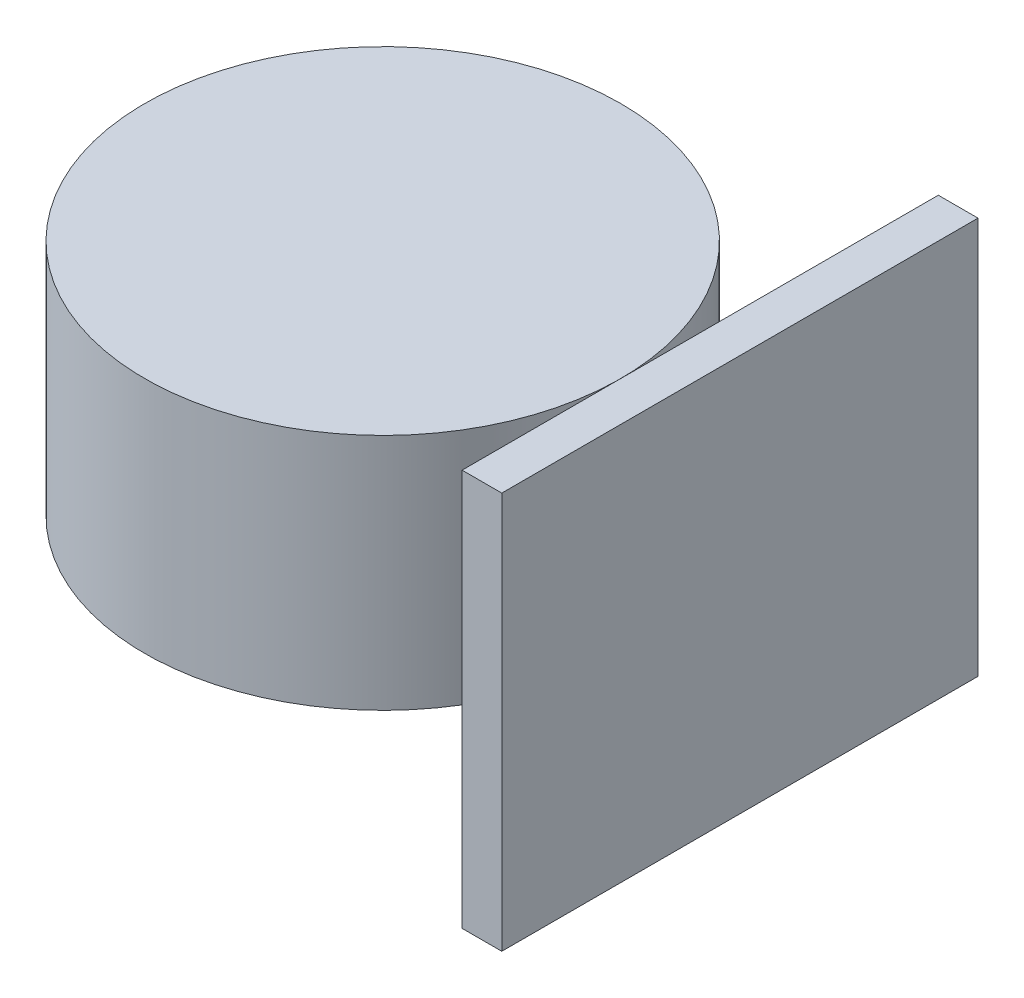
ISO-10303-21;
HEADER;
FILE_DESCRIPTION(('STEP AP214'),'2;1');
FILE_NAME('part.step','',(''),(''),'','','');
FILE_SCHEMA(('AUTOMOTIVE_DESIGN { 1 0 10303 214 1 1 1 1 }'));
ENDSEC;
DATA;
#1=APPLICATION_CONTEXT('core data for automotive mechanical design processes');
#2=APPLICATION_PROTOCOL_DEFINITION('international standard','automotive_design',2000,#1);
#3=PRODUCT_CONTEXT('',#1,'mechanical');
#4=PRODUCT('Part','Part','',(#3));
#5=PRODUCT_RELATED_PRODUCT_CATEGORY('part','',(#4));
#6=PRODUCT_DEFINITION_FORMATION('','',#4);
#7=PRODUCT_DEFINITION_CONTEXT('part definition',#1,'design');
#8=PRODUCT_DEFINITION('design','',#6,#7);
#9=PRODUCT_DEFINITION_SHAPE('','',#8);
#10=(LENGTH_UNIT() NAMED_UNIT(*) SI_UNIT(.MILLI.,.METRE.));
#11=(NAMED_UNIT(*) PLANE_ANGLE_UNIT() SI_UNIT($,.RADIAN.));
#12=(NAMED_UNIT(*) SI_UNIT($,.STERADIAN.) SOLID_ANGLE_UNIT());
#13=UNCERTAINTY_MEASURE_WITH_UNIT(LENGTH_MEASURE(1.E-05),#10,'distance_accuracy_value','');
#14=(GEOMETRIC_REPRESENTATION_CONTEXT(3) GLOBAL_UNCERTAINTY_ASSIGNED_CONTEXT((#13)) GLOBAL_UNIT_ASSIGNED_CONTEXT((#10,
#11,#12)) REPRESENTATION_CONTEXT('',''));
#15=CARTESIAN_POINT('',(0.,0.,0.));
#16=DIRECTION('',(0.,0.,1.));
#17=DIRECTION('',(1.,0.,0.));
#18=AXIS2_PLACEMENT_3D('',#15,#16,#17);
#19=CARTESIAN_POINT('',(0.,15.,0.));
#20=DIRECTION('',(0.,-1.,0.));
#21=DIRECTION('',(0.,0.,1.));
#22=AXIS2_PLACEMENT_3D('',#19,#20,#21);
#23=CYLINDRICAL_SURFACE('',#22,30.);
#24=CARTESIAN_POINT('',(0.,-15.,0.));
#25=DIRECTION('',(0.,-1.,0.));
#26=DIRECTION('',(0.,0.,-1.));
#27=AXIS2_PLACEMENT_3D('',#24,#25,#26);
#28=CIRCLE('',#27,30.);
#29=CARTESIAN_POINT('',(0.,-15.,-30.));
#30=VERTEX_POINT('',#29);
#31=EDGE_CURVE('E167',#30,#30,#28,.T.);
#32=ORIENTED_EDGE('',*,*,#31,.F.);
#33=EDGE_LOOP('',(#32));
#34=FACE_BOUND('',#33,.T.);
#35=CARTESIAN_POINT('',(0.,15.,0.));
#36=DIRECTION('',(0.,-1.,0.));
#37=DIRECTION('',(0.,0.,-1.));
#38=AXIS2_PLACEMENT_3D('',#35,#36,#37);
#39=CIRCLE('',#38,30.);
#40=CARTESIAN_POINT('',(0.,15.,-30.));
#41=VERTEX_POINT('',#40);
#42=EDGE_CURVE('E168',#41,#41,#39,.T.);
#43=ORIENTED_EDGE('',*,*,#42,.T.);
#44=EDGE_LOOP('',(#43));
#45=FACE_BOUND('',#44,.T.);
#46=DIRECTION('',(0.,-1.,0.));
#47=VECTOR('',#46,1.);
#48=CARTESIAN_POINT('',(28.2842712474619,15.,10.));
#49=LINE('',#48,#47);
#50=CARTESIAN_POINT('',(28.2842712474619,-10.,10.));
#51=VERTEX_POINT('',#50);
#52=CARTESIAN_POINT('',(28.2842712474619,10.,10.));
#53=VERTEX_POINT('',#52);
#54=EDGE_CURVE('E11',#51,#53,#49,.F.);
#55=ORIENTED_EDGE('',*,*,#54,.T.);
#56=CARTESIAN_POINT('',(0.,10.,0.));
#57=DIRECTION('',(0.,1.,0.));
#58=DIRECTION('',(0.,0.,1.));
#59=AXIS2_PLACEMENT_3D('',#56,#57,#58);
#60=CIRCLE('',#59,30.);
#61=CARTESIAN_POINT('',(28.2842712474619,10.,-10.));
#62=VERTEX_POINT('',#61);
#63=EDGE_CURVE('E50',#53,#62,#60,.T.);
#64=ORIENTED_EDGE('',*,*,#63,.T.);
#65=DIRECTION('',(0.,-1.,0.));
#66=VECTOR('',#65,1.);
#67=CARTESIAN_POINT('',(28.2842712474619,15.,-10.));
#68=LINE('',#67,#66);
#69=CARTESIAN_POINT('',(28.2842712474619,-10.,-10.));
#70=VERTEX_POINT('',#69);
#71=EDGE_CURVE('E176',#62,#70,#68,.T.);
#72=ORIENTED_EDGE('',*,*,#71,.T.);
#73=CARTESIAN_POINT('',(0.,-10.,0.));
#74=DIRECTION('',(0.,-1.,0.));
#75=DIRECTION('',(0.,0.,-1.));
#76=AXIS2_PLACEMENT_3D('',#73,#74,#75);
#77=CIRCLE('',#76,30.);
#78=EDGE_CURVE('E171',#70,#51,#77,.T.);
#79=ORIENTED_EDGE('',*,*,#78,.T.);
#80=EDGE_LOOP('',(#55,#64,#72,#79));
#81=FACE_BOUND('',#80,.T.);
#82=ADVANCED_FACE('F43',(#34,#45,#81),#23,.T.);
#83=CARTESIAN_POINT('',(0.,15.,0.));
#84=DIRECTION('',(0.,1.,0.));
#85=DIRECTION('',(0.,0.,-1.));
#86=AXIS2_PLACEMENT_3D('',#83,#84,#85);
#87=PLANE('',#86);
#88=ORIENTED_EDGE('',*,*,#42,.F.);
#89=EDGE_LOOP('',(#88));
#90=FACE_BOUND('',#89,.T.);
#91=ADVANCED_FACE('F204',(#90),#87,.T.);
#92=CARTESIAN_POINT('',(0.,-15.,0.));
#93=DIRECTION('',(0.,1.,0.));
#94=DIRECTION('',(0.,0.,-1.));
#95=AXIS2_PLACEMENT_3D('',#92,#93,#94);
#96=PLANE('',#95);
#97=ORIENTED_EDGE('',*,*,#31,.T.);
#98=EDGE_LOOP('',(#97));
#99=FACE_BOUND('',#98,.T.);
#100=ADVANCED_FACE('F209',(#99),#96,.F.);
#101=CARTESIAN_POINT('',(40.,-10.,10.));
#102=DIRECTION('',(0.,0.,-1.));
#103=DIRECTION('',(1.,0.,0.));
#104=AXIS2_PLACEMENT_3D('',#101,#102,#103);
#105=PLANE('',#104);
#106=DIRECTION('',(-1.,0.,0.));
#107=VECTOR('',#106,1.);
#108=CARTESIAN_POINT('',(40.,-10.,10.));
#109=LINE('',#108,#107);
#110=CARTESIAN_POINT('',(40.,-10.,10.));
#111=VERTEX_POINT('',#110);
#112=EDGE_CURVE('E161',#111,#51,#109,.T.);
#113=ORIENTED_EDGE('',*,*,#112,.F.);
#114=DIRECTION('',(0.,1.,0.));
#115=VECTOR('',#114,1.);
#116=CARTESIAN_POINT('',(40.,-10.,10.));
#117=LINE('',#116,#115);
#118=CARTESIAN_POINT('',(40.,10.,10.));
#119=VERTEX_POINT('',#118);
#120=EDGE_CURVE('E129',#111,#119,#117,.T.);
#121=ORIENTED_EDGE('',*,*,#120,.T.);
#122=DIRECTION('',(-1.,0.,0.));
#123=VECTOR('',#122,1.);
#124=CARTESIAN_POINT('',(40.,10.,10.));
#125=LINE('',#124,#123);
#126=EDGE_CURVE('E57',#119,#53,#125,.T.);
#127=ORIENTED_EDGE('',*,*,#126,.T.);
#128=ORIENTED_EDGE('',*,*,#54,.F.);
#129=EDGE_LOOP('',(#113,#121,#127,#128));
#130=FACE_BOUND('',#129,.T.);
#131=ADVANCED_FACE('F184',(#130),#105,.F.);
#132=CARTESIAN_POINT('',(40.,-10.,-10.));
#133=DIRECTION('',(0.,0.,1.));
#134=DIRECTION('',(-1.,0.,0.));
#135=AXIS2_PLACEMENT_3D('',#132,#133,#134);
#136=PLANE('',#135);
#137=DIRECTION('',(-1.,0.,0.));
#138=VECTOR('',#137,1.);
#139=CARTESIAN_POINT('',(40.,10.,-10.));
#140=LINE('',#139,#138);
#141=CARTESIAN_POINT('',(40.,10.,-10.));
#142=VERTEX_POINT('',#141);
#143=EDGE_CURVE('E64',#142,#62,#140,.T.);
#144=ORIENTED_EDGE('',*,*,#143,.F.);
#145=DIRECTION('',(0.,-1.,0.));
#146=VECTOR('',#145,1.);
#147=CARTESIAN_POINT('',(40.,-10.,-10.));
#148=LINE('',#147,#146);
#149=CARTESIAN_POINT('',(40.,-10.,-10.));
#150=VERTEX_POINT('',#149);
#151=EDGE_CURVE('E156',#142,#150,#148,.T.);
#152=ORIENTED_EDGE('',*,*,#151,.T.);
#153=DIRECTION('',(-1.,0.,0.));
#154=VECTOR('',#153,1.);
#155=CARTESIAN_POINT('',(40.,-10.,-10.));
#156=LINE('',#155,#154);
#157=EDGE_CURVE('E163',#150,#70,#156,.T.);
#158=ORIENTED_EDGE('',*,*,#157,.T.);
#159=ORIENTED_EDGE('',*,*,#71,.F.);
#160=EDGE_LOOP('',(#144,#152,#158,#159));
#161=FACE_BOUND('',#160,.T.);
#162=ADVANCED_FACE('F190',(#161),#136,.F.);
#163=CARTESIAN_POINT('',(40.,10.,-10.));
#164=DIRECTION('',(0.,-1.,0.));
#165=DIRECTION('',(0.,0.,1.));
#166=AXIS2_PLACEMENT_3D('',#163,#164,#165);
#167=PLANE('',#166);
#168=ORIENTED_EDGE('',*,*,#126,.F.);
#169=DIRECTION('',(0.,0.,-1.));
#170=VECTOR('',#169,1.);
#171=CARTESIAN_POINT('',(40.,10.,-10.));
#172=LINE('',#171,#170);
#173=EDGE_CURVE('E154',#119,#142,#172,.T.);
#174=ORIENTED_EDGE('',*,*,#173,.T.);
#175=ORIENTED_EDGE('',*,*,#143,.T.);
#176=ORIENTED_EDGE('',*,*,#63,.F.);
#177=EDGE_LOOP('',(#168,#174,#175,#176));
#178=FACE_BOUND('',#177,.T.);
#179=ADVANCED_FACE('F180',(#178),#167,.F.);
#180=CARTESIAN_POINT('',(40.,-10.,-10.));
#181=DIRECTION('',(0.,1.,0.));
#182=DIRECTION('',(0.,0.,-1.));
#183=AXIS2_PLACEMENT_3D('',#180,#181,#182);
#184=PLANE('',#183);
#185=ORIENTED_EDGE('',*,*,#157,.F.);
#186=DIRECTION('',(0.,0.,1.));
#187=VECTOR('',#186,1.);
#188=CARTESIAN_POINT('',(40.,-10.,-10.));
#189=LINE('',#188,#187);
#190=EDGE_CURVE('E159',#150,#111,#189,.T.);
#191=ORIENTED_EDGE('',*,*,#190,.T.);
#192=ORIENTED_EDGE('',*,*,#112,.T.);
#193=ORIENTED_EDGE('',*,*,#78,.F.);
#194=EDGE_LOOP('',(#185,#191,#192,#193));
#195=FACE_BOUND('',#194,.T.);
#196=ADVANCED_FACE('F193',(#195),#184,.F.);
#197=CARTESIAN_POINT('',(45.,-25.,30.));
#198=DIRECTION('',(0.,0.,-1.));
#199=DIRECTION('',(1.,0.,0.));
#200=AXIS2_PLACEMENT_3D('',#197,#198,#199);
#201=PLANE('',#200);
#202=DIRECTION('',(0.,1.,0.));
#203=VECTOR('',#202,1.);
#204=CARTESIAN_POINT('',(40.,-25.,30.));
#205=LINE('',#204,#203);
#206=CARTESIAN_POINT('',(40.,-25.,30.));
#207=VERTEX_POINT('',#206);
#208=CARTESIAN_POINT('',(40.,25.,30.));
#209=VERTEX_POINT('',#208);
#210=EDGE_CURVE('E143',#207,#209,#205,.T.);
#211=ORIENTED_EDGE('',*,*,#210,.F.);
#212=DIRECTION('',(-1.,0.,0.));
#213=VECTOR('',#212,1.);
#214=CARTESIAN_POINT('',(45.,-25.,30.));
#215=LINE('',#214,#213);
#216=CARTESIAN_POINT('',(45.,-25.,30.));
#217=VERTEX_POINT('',#216);
#218=EDGE_CURVE('E134',#217,#207,#215,.T.);
#219=ORIENTED_EDGE('',*,*,#218,.F.);
#220=DIRECTION('',(0.,1.,0.));
#221=VECTOR('',#220,1.);
#222=CARTESIAN_POINT('',(45.,-25.,30.));
#223=LINE('',#222,#221);
#224=CARTESIAN_POINT('',(45.,25.,30.));
#225=VERTEX_POINT('',#224);
#226=EDGE_CURVE('E113',#217,#225,#223,.T.);
#227=ORIENTED_EDGE('',*,*,#226,.T.);
#228=DIRECTION('',(-1.,0.,0.));
#229=VECTOR('',#228,1.);
#230=CARTESIAN_POINT('',(45.,25.,30.));
#231=LINE('',#230,#229);
#232=EDGE_CURVE('E122',#225,#209,#231,.T.);
#233=ORIENTED_EDGE('',*,*,#232,.T.);
#234=EDGE_LOOP('',(#211,#219,#227,#233));
#235=FACE_BOUND('',#234,.T.);
#236=ADVANCED_FACE('F132',(#235),#201,.F.);
#237=CARTESIAN_POINT('',(45.,25.,-30.));
#238=DIRECTION('',(0.,-1.,0.));
#239=DIRECTION('',(0.,0.,1.));
#240=AXIS2_PLACEMENT_3D('',#237,#238,#239);
#241=PLANE('',#240);
#242=DIRECTION('',(0.,0.,-1.));
#243=VECTOR('',#242,1.);
#244=CARTESIAN_POINT('',(40.,25.,-30.));
#245=LINE('',#244,#243);
#246=CARTESIAN_POINT('',(40.,25.,-30.));
#247=VERTEX_POINT('',#246);
#248=EDGE_CURVE('E125',#209,#247,#245,.T.);
#249=ORIENTED_EDGE('',*,*,#248,.F.);
#250=ORIENTED_EDGE('',*,*,#232,.F.);
#251=DIRECTION('',(0.,0.,-1.));
#252=VECTOR('',#251,1.);
#253=CARTESIAN_POINT('',(45.,25.,-30.));
#254=LINE('',#253,#252);
#255=CARTESIAN_POINT('',(45.,25.,-30.));
#256=VERTEX_POINT('',#255);
#257=EDGE_CURVE('E109',#225,#256,#254,.T.);
#258=ORIENTED_EDGE('',*,*,#257,.T.);
#259=DIRECTION('',(-1.,0.,0.));
#260=VECTOR('',#259,1.);
#261=CARTESIAN_POINT('',(45.,25.,-30.));
#262=LINE('',#261,#260);
#263=EDGE_CURVE('E130',#256,#247,#262,.T.);
#264=ORIENTED_EDGE('',*,*,#263,.T.);
#265=EDGE_LOOP('',(#249,#250,#258,#264));
#266=FACE_BOUND('',#265,.T.);
#267=ADVANCED_FACE('F123',(#266),#241,.F.);
#268=CARTESIAN_POINT('',(45.,-25.,-30.));
#269=DIRECTION('',(0.,0.,1.));
#270=DIRECTION('',(-1.,0.,0.));
#271=AXIS2_PLACEMENT_3D('',#268,#269,#270);
#272=PLANE('',#271);
#273=DIRECTION('',(0.,-1.,0.));
#274=VECTOR('',#273,1.);
#275=CARTESIAN_POINT('',(40.,-25.,-30.));
#276=LINE('',#275,#274);
#277=CARTESIAN_POINT('',(40.,-25.,-30.));
#278=VERTEX_POINT('',#277);
#279=EDGE_CURVE('E137',#247,#278,#276,.T.);
#280=ORIENTED_EDGE('',*,*,#279,.F.);
#281=ORIENTED_EDGE('',*,*,#263,.F.);
#282=DIRECTION('',(0.,-1.,0.));
#283=VECTOR('',#282,1.);
#284=CARTESIAN_POINT('',(45.,-25.,-30.));
#285=LINE('',#284,#283);
#286=CARTESIAN_POINT('',(45.,-25.,-30.));
#287=VERTEX_POINT('',#286);
#288=EDGE_CURVE('E116',#256,#287,#285,.T.);
#289=ORIENTED_EDGE('',*,*,#288,.T.);
#290=DIRECTION('',(-1.,0.,0.));
#291=VECTOR('',#290,1.);
#292=CARTESIAN_POINT('',(45.,-25.,-30.));
#293=LINE('',#292,#291);
#294=EDGE_CURVE('E149',#287,#278,#293,.T.);
#295=ORIENTED_EDGE('',*,*,#294,.T.);
#296=EDGE_LOOP('',(#280,#281,#289,#295));
#297=FACE_BOUND('',#296,.T.);
#298=ADVANCED_FACE('F252',(#297),#272,.F.);
#299=CARTESIAN_POINT('',(45.,-25.,-30.));
#300=DIRECTION('',(0.,1.,0.));
#301=DIRECTION('',(0.,0.,-1.));
#302=AXIS2_PLACEMENT_3D('',#299,#300,#301);
#303=PLANE('',#302);
#304=DIRECTION('',(0.,0.,1.));
#305=VECTOR('',#304,1.);
#306=CARTESIAN_POINT('',(40.,-25.,-30.));
#307=LINE('',#306,#305);
#308=EDGE_CURVE('E135',#278,#207,#307,.T.);
#309=ORIENTED_EDGE('',*,*,#308,.F.);
#310=ORIENTED_EDGE('',*,*,#294,.F.);
#311=DIRECTION('',(0.,0.,1.));
#312=VECTOR('',#311,1.);
#313=CARTESIAN_POINT('',(45.,-25.,-30.));
#314=LINE('',#313,#312);
#315=EDGE_CURVE('E141',#287,#217,#314,.T.);
#316=ORIENTED_EDGE('',*,*,#315,.T.);
#317=ORIENTED_EDGE('',*,*,#218,.T.);
#318=EDGE_LOOP('',(#309,#310,#316,#317));
#319=FACE_BOUND('',#318,.T.);
#320=ADVANCED_FACE('F261',(#319),#303,.F.);
#321=CARTESIAN_POINT('',(45.,0.,0.));
#322=DIRECTION('',(-1.,0.,0.));
#323=DIRECTION('',(0.,0.,-1.));
#324=AXIS2_PLACEMENT_3D('',#321,#322,#323);
#325=PLANE('',#324);
#326=ORIENTED_EDGE('',*,*,#226,.F.);
#327=ORIENTED_EDGE('',*,*,#315,.F.);
#328=ORIENTED_EDGE('',*,*,#288,.F.);
#329=ORIENTED_EDGE('',*,*,#257,.F.);
#330=EDGE_LOOP('',(#326,#327,#328,#329));
#331=FACE_BOUND('',#330,.T.);
#332=ADVANCED_FACE('F111',(#331),#325,.F.);
#333=CARTESIAN_POINT('',(40.,0.,0.));
#334=DIRECTION('',(-1.,0.,0.));
#335=DIRECTION('',(0.,0.,-1.));
#336=AXIS2_PLACEMENT_3D('',#333,#334,#335);
#337=PLANE('',#336);
#338=ORIENTED_EDGE('',*,*,#190,.F.);
#339=ORIENTED_EDGE('',*,*,#151,.F.);
#340=ORIENTED_EDGE('',*,*,#173,.F.);
#341=ORIENTED_EDGE('',*,*,#120,.F.);
#342=EDGE_LOOP('',(#338,#339,#340,#341));
#343=FACE_BOUND('',#342,.T.);
#344=ORIENTED_EDGE('',*,*,#210,.T.);
#345=ORIENTED_EDGE('',*,*,#248,.T.);
#346=ORIENTED_EDGE('',*,*,#279,.T.);
#347=ORIENTED_EDGE('',*,*,#308,.T.);
#348=EDGE_LOOP('',(#344,#345,#346,#347));
#349=FACE_BOUND('',#348,.T.);
#350=ADVANCED_FACE('F186',(#343,#349),#337,.T.);
#351=CLOSED_SHELL('',(#82,#91,#100,#131,#162,#179,#196,#236,#267,#298,#320,#332,#350));
#352=MANIFOLD_SOLID_BREP('B2',#351);
#353=ADVANCED_BREP_SHAPE_REPRESENTATION('',(#18,#352),#14);
#354=SHAPE_DEFINITION_REPRESENTATION(#9,#353);
ENDSEC;
END-ISO-10303-21;
